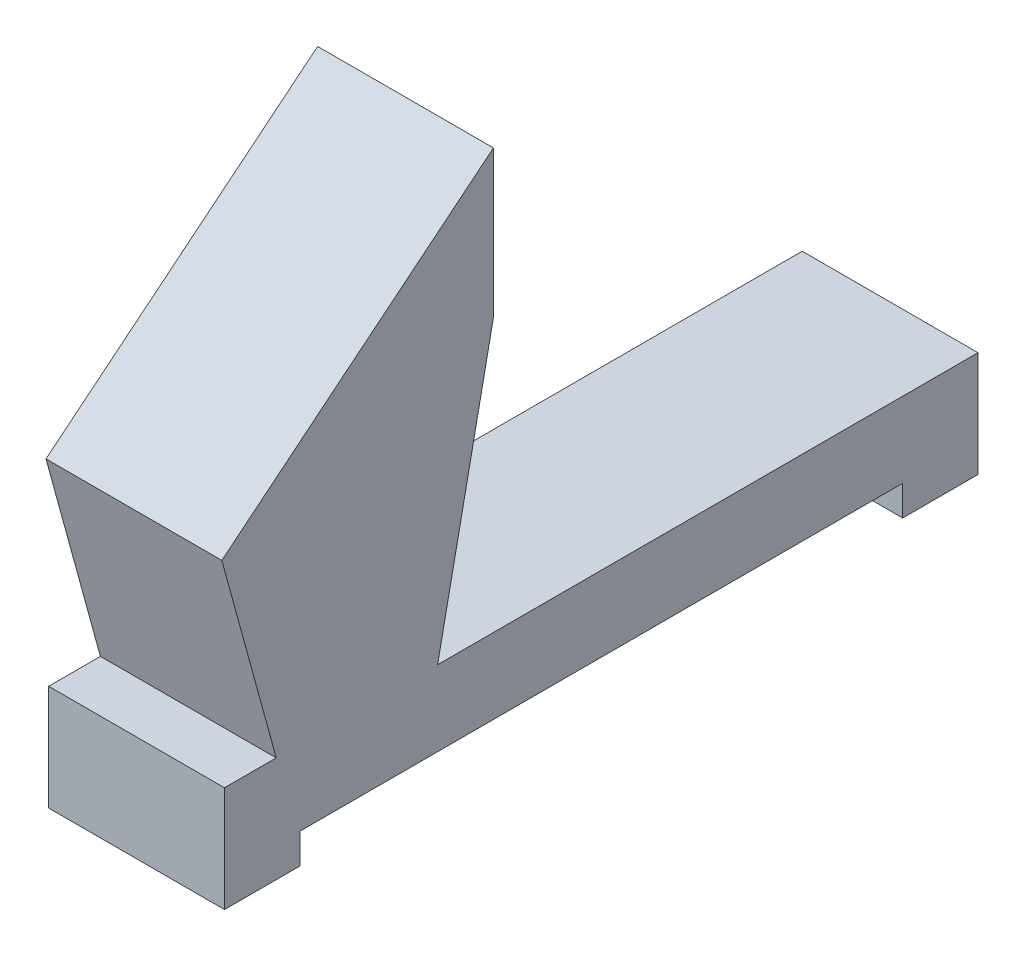
ISO-10303-21;
HEADER;
FILE_DESCRIPTION(('STEP AP214'),'2;1');
FILE_NAME('part.step','',(''),(''),'','','');
FILE_SCHEMA(('AUTOMOTIVE_DESIGN { 1 0 10303 214 1 1 1 1 }'));
ENDSEC;
DATA;
#1=APPLICATION_CONTEXT('core data for automotive mechanical design processes');
#2=APPLICATION_PROTOCOL_DEFINITION('international standard','automotive_design',2000,#1);
#3=PRODUCT_CONTEXT('',#1,'mechanical');
#4=PRODUCT('Part','Part','',(#3));
#5=PRODUCT_RELATED_PRODUCT_CATEGORY('part','',(#4));
#6=PRODUCT_DEFINITION_FORMATION('','',#4);
#7=PRODUCT_DEFINITION_CONTEXT('part definition',#1,'design');
#8=PRODUCT_DEFINITION('design','',#6,#7);
#9=PRODUCT_DEFINITION_SHAPE('','',#8);
#10=(LENGTH_UNIT() NAMED_UNIT(*) SI_UNIT(.MILLI.,.METRE.));
#11=(NAMED_UNIT(*) PLANE_ANGLE_UNIT() SI_UNIT($,.RADIAN.));
#12=(NAMED_UNIT(*) SI_UNIT($,.STERADIAN.) SOLID_ANGLE_UNIT());
#13=UNCERTAINTY_MEASURE_WITH_UNIT(LENGTH_MEASURE(1.E-05),#10,'distance_accuracy_value','');
#14=(GEOMETRIC_REPRESENTATION_CONTEXT(3) GLOBAL_UNCERTAINTY_ASSIGNED_CONTEXT((#13)) GLOBAL_UNIT_ASSIGNED_CONTEXT((#10,
#11,#12)) REPRESENTATION_CONTEXT('',''));
#15=CARTESIAN_POINT('',(0.,0.,0.));
#16=DIRECTION('',(0.,0.,1.));
#17=DIRECTION('',(1.,0.,0.));
#18=AXIS2_PLACEMENT_3D('',#15,#16,#17);
#19=CARTESIAN_POINT('',(-123.551519536903,-126.155426917511,7.50000000000059));
#20=DIRECTION('',(0.,1.,0.));
#21=DIRECTION('',(0.,0.,1.));
#22=AXIS2_PLACEMENT_3D('',#19,#20,#21);
#23=PLANE('',#22);
#24=DIRECTION('',(1.,0.,0.));
#25=VECTOR('',#24,1.);
#26=CARTESIAN_POINT('',(-123.551519536903,-126.155426917511,6.00000000000059));
#27=LINE('',#26,#25);
#28=CARTESIAN_POINT('',(-127.051519536903,-126.155426917511,6.00000000000059));
#29=VERTEX_POINT('',#28);
#30=CARTESIAN_POINT('',(-123.551519536903,-126.155426917511,6.00000000000059));
#31=VERTEX_POINT('',#30);
#32=EDGE_CURVE('E162',#29,#31,#27,.T.);
#33=ORIENTED_EDGE('',*,*,#32,.T.);
#34=DIRECTION('',(0.,0.,1.));
#35=VECTOR('',#34,1.);
#36=CARTESIAN_POINT('',(-123.551519536903,-126.155426917511,17.0639403381122));
#37=LINE('',#36,#35);
#38=CARTESIAN_POINT('',(-123.551519536903,-126.155426917511,7.50000000000059));
#39=VERTEX_POINT('',#38);
#40=EDGE_CURVE('E127',#31,#39,#37,.T.);
#41=ORIENTED_EDGE('',*,*,#40,.T.);
#42=DIRECTION('',(-1.,0.,0.));
#43=VECTOR('',#42,1.);
#44=CARTESIAN_POINT('',(-123.551519536903,-126.155426917511,7.50000000000059));
#45=LINE('',#44,#43);
#46=CARTESIAN_POINT('',(-127.051519536903,-126.155426917511,7.50000000000059));
#47=VERTEX_POINT('',#46);
#48=EDGE_CURVE('E125',#39,#47,#45,.T.);
#49=ORIENTED_EDGE('',*,*,#48,.T.);
#50=DIRECTION('',(0.,0.,1.));
#51=VECTOR('',#50,1.);
#52=CARTESIAN_POINT('',(-127.051519536903,-126.155426917511,7.50000000000059));
#53=LINE('',#52,#51);
#54=EDGE_CURVE('E20',#29,#47,#53,.T.);
#55=ORIENTED_EDGE('',*,*,#54,.F.);
#56=EDGE_LOOP('',(#33,#41,#49,#55));
#57=FACE_BOUND('',#56,.T.);
#58=ADVANCED_FACE('F17',(#57),#23,.F.);
#59=CARTESIAN_POINT('',(-123.551519536903,-125.555426917511,19.5000000000006));
#60=DIRECTION('',(0.,0.,1.));
#61=DIRECTION('',(0.,-1.,0.));
#62=AXIS2_PLACEMENT_3D('',#59,#60,#61);
#63=PLANE('',#62);
#64=DIRECTION('',(1.,0.,0.));
#65=VECTOR('',#64,1.);
#66=CARTESIAN_POINT('',(-123.551519536903,-125.555426917511,19.5000000000006));
#67=LINE('',#66,#65);
#68=CARTESIAN_POINT('',(-127.051519536903,-125.555426917511,19.5000000000006));
#69=VERTEX_POINT('',#68);
#70=CARTESIAN_POINT('',(-123.551519536903,-125.555426917511,19.5000000000006));
#71=VERTEX_POINT('',#70);
#72=EDGE_CURVE('E168',#69,#71,#67,.T.);
#73=ORIENTED_EDGE('',*,*,#72,.T.);
#74=DIRECTION('',(0.,-1.,0.));
#75=VECTOR('',#74,1.);
#76=CARTESIAN_POINT('',(-123.551519536903,-125.555426917511,19.5000000000006));
#77=LINE('',#76,#75);
#78=CARTESIAN_POINT('',(-123.551519536903,-126.155426917511,19.5000000000006));
#79=VERTEX_POINT('',#78);
#80=EDGE_CURVE('E146',#71,#79,#77,.T.);
#81=ORIENTED_EDGE('',*,*,#80,.T.);
#82=DIRECTION('',(1.,0.,0.));
#83=VECTOR('',#82,1.);
#84=CARTESIAN_POINT('',(-123.551519536903,-126.155426917511,19.5000000000006));
#85=LINE('',#84,#83);
#86=CARTESIAN_POINT('',(-127.051519536903,-126.155426917511,19.5000000000006));
#87=VERTEX_POINT('',#86);
#88=EDGE_CURVE('E135',#79,#87,#85,.F.);
#89=ORIENTED_EDGE('',*,*,#88,.T.);
#90=DIRECTION('',(0.,-1.,0.));
#91=VECTOR('',#90,1.);
#92=CARTESIAN_POINT('',(-127.051519536903,-125.555426917511,19.5000000000006));
#93=LINE('',#92,#91);
#94=EDGE_CURVE('E109',#69,#87,#93,.T.);
#95=ORIENTED_EDGE('',*,*,#94,.F.);
#96=EDGE_LOOP('',(#73,#81,#89,#95));
#97=FACE_BOUND('',#96,.T.);
#98=ADVANCED_FACE('F245',(#97),#63,.F.);
#99=CARTESIAN_POINT('',(-123.551519536903,-126.155426917511,7.50000000000059));
#100=DIRECTION('',(0.,0.,-1.));
#101=DIRECTION('',(-1.,0.,0.));
#102=AXIS2_PLACEMENT_3D('',#99,#100,#101);
#103=PLANE('',#102);
#104=ORIENTED_EDGE('',*,*,#48,.F.);
#105=DIRECTION('',(0.,-1.,0.));
#106=VECTOR('',#105,1.);
#107=CARTESIAN_POINT('',(-123.551519536903,-125.555426917511,7.50000000000059));
#108=LINE('',#107,#106);
#109=CARTESIAN_POINT('',(-123.551519536903,-125.555426917511,7.50000000000059));
#110=VERTEX_POINT('',#109);
#111=EDGE_CURVE('E144',#39,#110,#108,.F.);
#112=ORIENTED_EDGE('',*,*,#111,.T.);
#113=DIRECTION('',(1.,0.,0.));
#114=VECTOR('',#113,1.);
#115=CARTESIAN_POINT('',(-123.551519536903,-125.555426917511,7.50000000000059));
#116=LINE('',#115,#114);
#117=CARTESIAN_POINT('',(-127.051519536903,-125.555426917511,7.50000000000059));
#118=VERTEX_POINT('',#117);
#119=EDGE_CURVE('E133',#110,#118,#116,.F.);
#120=ORIENTED_EDGE('',*,*,#119,.T.);
#121=DIRECTION('',(0.,1.,0.));
#122=VECTOR('',#121,1.);
#123=CARTESIAN_POINT('',(-127.051519536903,-126.155426917511,7.50000000000059));
#124=LINE('',#123,#122);
#125=EDGE_CURVE('E117',#47,#118,#124,.T.);
#126=ORIENTED_EDGE('',*,*,#125,.F.);
#127=EDGE_LOOP('',(#104,#112,#120,#126));
#128=FACE_BOUND('',#127,.T.);
#129=ADVANCED_FACE('F131',(#128),#103,.F.);
#130=CARTESIAN_POINT('',(-123.551519536903,-126.155426917511,19.5000000000006));
#131=DIRECTION('',(0.,1.,0.));
#132=DIRECTION('',(0.,0.,1.));
#133=AXIS2_PLACEMENT_3D('',#130,#131,#132);
#134=PLANE('',#133);
#135=ORIENTED_EDGE('',*,*,#88,.F.);
#136=DIRECTION('',(0.,0.,1.));
#137=VECTOR('',#136,1.);
#138=CARTESIAN_POINT('',(-123.551519536903,-126.155426917511,17.0639403381122));
#139=LINE('',#138,#137);
#140=CARTESIAN_POINT('',(-123.551519536903,-126.155426917511,21.0000000000006));
#141=VERTEX_POINT('',#140);
#142=EDGE_CURVE('E148',#79,#141,#139,.T.);
#143=ORIENTED_EDGE('',*,*,#142,.T.);
#144=DIRECTION('',(-1.,0.,0.));
#145=VECTOR('',#144,1.);
#146=CARTESIAN_POINT('',(-123.551519536903,-126.155426917511,21.0000000000006));
#147=LINE('',#146,#145);
#148=CARTESIAN_POINT('',(-127.051519536903,-126.155426917511,21.0000000000006));
#149=VERTEX_POINT('',#148);
#150=EDGE_CURVE('E179',#141,#149,#147,.T.);
#151=ORIENTED_EDGE('',*,*,#150,.T.);
#152=DIRECTION('',(0.,0.,1.));
#153=VECTOR('',#152,1.);
#154=CARTESIAN_POINT('',(-127.051519536903,-126.155426917511,19.5000000000006));
#155=LINE('',#154,#153);
#156=EDGE_CURVE('E137',#87,#149,#155,.T.);
#157=ORIENTED_EDGE('',*,*,#156,.F.);
#158=EDGE_LOOP('',(#135,#143,#151,#157));
#159=FACE_BOUND('',#158,.T.);
#160=ADVANCED_FACE('F249',(#159),#134,.F.);
#161=CARTESIAN_POINT('',(-123.551519536903,-124.055426917511,19.9700041097668));
#162=DIRECTION('',(0.,-1.,0.));
#163=DIRECTION('',(1.,0.,0.));
#164=AXIS2_PLACEMENT_3D('',#161,#162,#163);
#165=PLANE('',#164);
#166=DIRECTION('',(-1.,0.,0.));
#167=VECTOR('',#166,1.);
#168=CARTESIAN_POINT('',(-123.551519536903,-124.055426917511,21.0000000000006));
#169=LINE('',#168,#167);
#170=CARTESIAN_POINT('',(-127.051519536903,-124.055426917511,21.0000000000006));
#171=VERTEX_POINT('',#170);
#172=CARTESIAN_POINT('',(-123.551519536903,-124.055426917511,21.0000000000006));
#173=VERTEX_POINT('',#172);
#174=EDGE_CURVE('E174',#171,#173,#169,.F.);
#175=ORIENTED_EDGE('',*,*,#174,.T.);
#176=DIRECTION('',(0.,0.,1.));
#177=VECTOR('',#176,1.);
#178=CARTESIAN_POINT('',(-123.551519536903,-124.055426917511,17.0639403381122));
#179=LINE('',#178,#177);
#180=CARTESIAN_POINT('',(-123.551519536903,-124.055426917511,19.9700041097668));
#181=VERTEX_POINT('',#180);
#182=EDGE_CURVE('E150',#173,#181,#179,.F.);
#183=ORIENTED_EDGE('',*,*,#182,.T.);
#184=DIRECTION('',(1.,0.,0.));
#185=VECTOR('',#184,1.);
#186=CARTESIAN_POINT('',(-123.551519536903,-124.055426917511,19.9700041097666));
#187=LINE('',#186,#185);
#188=CARTESIAN_POINT('',(-127.051519536903,-124.055426917511,19.9700041097668));
#189=VERTEX_POINT('',#188);
#190=EDGE_CURVE('E185',#181,#189,#187,.F.);
#191=ORIENTED_EDGE('',*,*,#190,.T.);
#192=DIRECTION('',(0.,0.,1.));
#193=VECTOR('',#192,1.);
#194=CARTESIAN_POINT('',(-127.051519536903,-124.055426917511,19.9700041097668));
#195=LINE('',#194,#193);
#196=EDGE_CURVE('E141',#171,#189,#195,.F.);
#197=ORIENTED_EDGE('',*,*,#196,.F.);
#198=EDGE_LOOP('',(#175,#183,#191,#197));
#199=FACE_BOUND('',#198,.T.);
#200=ADVANCED_FACE('F211',(#199),#165,.F.);
#201=CARTESIAN_POINT('',(-123.551519536903,-125.555426917511,17.0639403381122));
#202=DIRECTION('',(-1.,0.,0.));
#203=DIRECTION('',(0.,-1.,0.));
#204=AXIS2_PLACEMENT_3D('',#201,#202,#203);
#205=PLANE('',#204);
#206=DIRECTION('',(0.,-1.,0.));
#207=VECTOR('',#206,1.);
#208=CARTESIAN_POINT('',(-123.551519536903,-118.624720028178,15.6459770039855));
#209=LINE('',#208,#207);
#210=CARTESIAN_POINT('',(-123.551519536903,-118.624720028178,15.6459770039855));
#211=VERTEX_POINT('',#210);
#212=CARTESIAN_POINT('',(-123.551519536903,-115.701944266897,15.6459770039855));
#213=VERTEX_POINT('',#212);
#214=EDGE_CURVE('E152',#211,#213,#209,.F.);
#215=ORIENTED_EDGE('',*,*,#214,.T.);
#216=DIRECTION('',(0.,0.631747448880966,-0.775174277715915));
#217=VECTOR('',#216,1.);
#218=CARTESIAN_POINT('',(-123.551519536903,-115.701944266897,15.6459770039855));
#219=LINE('',#218,#217);
#220=CARTESIAN_POINT('',(-123.551519536903,-120.10865222546,21.0531482793661));
#221=VERTEX_POINT('',#220);
#222=EDGE_CURVE('E191',#213,#221,#219,.F.);
#223=ORIENTED_EDGE('',*,*,#222,.T.);
#224=DIRECTION('',(0.,0.964343870689292,0.264652411785711));
#225=VECTOR('',#224,1.);
#226=CARTESIAN_POINT('',(-123.551519536903,-120.10865222546,21.0531482793661));
#227=LINE('',#226,#225);
#228=EDGE_CURVE('E182',#221,#181,#227,.F.);
#229=ORIENTED_EDGE('',*,*,#228,.T.);
#230=ORIENTED_EDGE('',*,*,#182,.F.);
#231=DIRECTION('',(0.,1.,0.));
#232=VECTOR('',#231,1.);
#233=CARTESIAN_POINT('',(-123.551519536903,-124.055426917511,21.0000000000006));
#234=LINE('',#233,#232);
#235=EDGE_CURVE('E176',#173,#141,#234,.F.);
#236=ORIENTED_EDGE('',*,*,#235,.T.);
#237=ORIENTED_EDGE('',*,*,#142,.F.);
#238=ORIENTED_EDGE('',*,*,#80,.F.);
#239=DIRECTION('',(0.,0.,1.));
#240=VECTOR('',#239,1.);
#241=CARTESIAN_POINT('',(-123.551519536903,-125.555426917511,7.50000000000059));
#242=LINE('',#241,#240);
#243=EDGE_CURVE('E170',#71,#110,#242,.F.);
#244=ORIENTED_EDGE('',*,*,#243,.T.);
#245=ORIENTED_EDGE('',*,*,#111,.F.);
#246=ORIENTED_EDGE('',*,*,#40,.F.);
#247=DIRECTION('',(0.,-1.,0.));
#248=VECTOR('',#247,1.);
#249=CARTESIAN_POINT('',(-123.551519536903,-126.155426917511,6.00000000000059));
#250=LINE('',#249,#248);
#251=CARTESIAN_POINT('',(-123.551519536903,-124.055426917511,6.00000000000059));
#252=VERTEX_POINT('',#251);
#253=EDGE_CURVE('E164',#31,#252,#250,.F.);
#254=ORIENTED_EDGE('',*,*,#253,.T.);
#255=DIRECTION('',(0.,0.,1.));
#256=VECTOR('',#255,1.);
#257=CARTESIAN_POINT('',(-123.551519536903,-124.055426917511,6.00000000000059));
#258=LINE('',#257,#256);
#259=CARTESIAN_POINT('',(-123.551519536903,-124.055426917511,16.757053171312));
#260=VERTEX_POINT('',#259);
#261=EDGE_CURVE('E158',#252,#260,#258,.T.);
#262=ORIENTED_EDGE('',*,*,#261,.T.);
#263=DIRECTION('',(0.,-0.979706085298412,0.200439483209422));
#264=VECTOR('',#263,1.);
#265=CARTESIAN_POINT('',(-123.551519536903,-124.055426917511,16.757053171312));
#266=LINE('',#265,#264);
#267=EDGE_CURVE('E154',#260,#211,#266,.F.);
#268=ORIENTED_EDGE('',*,*,#267,.T.);
#269=EDGE_LOOP('',(#215,#223,#229,#230,#236,#237,#238,#244,#245,#246,#254,#262,#268));
#270=FACE_BOUND('',#269,.T.);
#271=ADVANCED_FACE('F216',(#270),#205,.F.);
#272=CARTESIAN_POINT('',(-123.551519536903,-118.624720028178,15.6459770039855));
#273=DIRECTION('',(0.,0.,1.));
#274=DIRECTION('',(0.,-1.,0.));
#275=AXIS2_PLACEMENT_3D('',#272,#273,#274);
#276=PLANE('',#275);
#277=DIRECTION('',(1.,0.,0.));
#278=VECTOR('',#277,1.);
#279=CARTESIAN_POINT('',(-123.551519536903,-115.701944266897,15.6459770039855));
#280=LINE('',#279,#278);
#281=CARTESIAN_POINT('',(-127.051519536903,-115.701944266897,15.6459770039855));
#282=VERTEX_POINT('',#281);
#283=EDGE_CURVE('E188',#282,#213,#280,.T.);
#284=ORIENTED_EDGE('',*,*,#283,.T.);
#285=ORIENTED_EDGE('',*,*,#214,.F.);
#286=DIRECTION('',(1.,0.,0.));
#287=VECTOR('',#286,1.);
#288=CARTESIAN_POINT('',(-123.551519536903,-118.624720028178,15.6459770039856));
#289=LINE('',#288,#287);
#290=CARTESIAN_POINT('',(-127.051519536903,-118.624720028178,15.6459770039855));
#291=VERTEX_POINT('',#290);
#292=EDGE_CURVE('E156',#211,#291,#289,.F.);
#293=ORIENTED_EDGE('',*,*,#292,.T.);
#294=DIRECTION('',(0.,-1.,0.));
#295=VECTOR('',#294,1.);
#296=CARTESIAN_POINT('',(-127.051519536903,-125.555426917511,15.6459770039855));
#297=LINE('',#296,#295);
#298=EDGE_CURVE('E194',#282,#291,#297,.T.);
#299=ORIENTED_EDGE('',*,*,#298,.F.);
#300=EDGE_LOOP('',(#284,#285,#293,#299));
#301=FACE_BOUND('',#300,.T.);
#302=ADVANCED_FACE('F223',(#301),#276,.F.);
#303=CARTESIAN_POINT('',(-123.551519536903,-124.055426917511,16.757053171312));
#304=DIRECTION('',(0.,0.200439483209422,0.979706085298412));
#305=DIRECTION('',(0.,-0.979706085298412,0.200439483209422));
#306=AXIS2_PLACEMENT_3D('',#303,#304,#305);
#307=PLANE('',#306);
#308=ORIENTED_EDGE('',*,*,#292,.F.);
#309=ORIENTED_EDGE('',*,*,#267,.F.);
#310=DIRECTION('',(1.,0.,0.));
#311=VECTOR('',#310,1.);
#312=CARTESIAN_POINT('',(-123.551519536903,-124.055426917511,16.757053171312));
#313=LINE('',#312,#311);
#314=CARTESIAN_POINT('',(-127.051519536903,-124.055426917511,16.757053171312));
#315=VERTEX_POINT('',#314);
#316=EDGE_CURVE('E160',#260,#315,#313,.F.);
#317=ORIENTED_EDGE('',*,*,#316,.T.);
#318=DIRECTION('',(0.,-0.97970608529841,0.200439483209431));
#319=VECTOR('',#318,1.);
#320=CARTESIAN_POINT('',(-127.051519536903,-118.624720028178,15.6459770039855));
#321=LINE('',#320,#319);
#322=EDGE_CURVE('E197',#291,#315,#321,.T.);
#323=ORIENTED_EDGE('',*,*,#322,.F.);
#324=EDGE_LOOP('',(#308,#309,#317,#323));
#325=FACE_BOUND('',#324,.T.);
#326=ADVANCED_FACE('F228',(#325),#307,.F.);
#327=CARTESIAN_POINT('',(-123.551519536903,-124.055426917511,6.00000000000059));
#328=DIRECTION('',(0.,-1.,0.));
#329=DIRECTION('',(1.,0.,0.));
#330=AXIS2_PLACEMENT_3D('',#327,#328,#329);
#331=PLANE('',#330);
#332=ORIENTED_EDGE('',*,*,#316,.F.);
#333=ORIENTED_EDGE('',*,*,#261,.F.);
#334=DIRECTION('',(1.,0.,0.));
#335=VECTOR('',#334,1.);
#336=CARTESIAN_POINT('',(-123.551519536903,-124.055426917511,6.00000000000059));
#337=LINE('',#336,#335);
#338=CARTESIAN_POINT('',(-127.051519536903,-124.055426917511,6.00000000000059));
#339=VERTEX_POINT('',#338);
#340=EDGE_CURVE('E166',#252,#339,#337,.F.);
#341=ORIENTED_EDGE('',*,*,#340,.T.);
#342=DIRECTION('',(0.,0.,1.));
#343=VECTOR('',#342,1.);
#344=CARTESIAN_POINT('',(-127.051519536903,-124.055426917511,17.0639403381122));
#345=LINE('',#344,#343);
#346=EDGE_CURVE('E200',#315,#339,#345,.F.);
#347=ORIENTED_EDGE('',*,*,#346,.F.);
#348=EDGE_LOOP('',(#332,#333,#341,#347));
#349=FACE_BOUND('',#348,.T.);
#350=ADVANCED_FACE('F233',(#349),#331,.F.);
#351=CARTESIAN_POINT('',(-123.551519536903,-126.155426917511,6.00000000000059));
#352=DIRECTION('',(0.,0.,1.));
#353=DIRECTION('',(0.,-1.,0.));
#354=AXIS2_PLACEMENT_3D('',#351,#352,#353);
#355=PLANE('',#354);
#356=ORIENTED_EDGE('',*,*,#340,.F.);
#357=ORIENTED_EDGE('',*,*,#253,.F.);
#358=ORIENTED_EDGE('',*,*,#32,.F.);
#359=DIRECTION('',(0.,-1.,0.));
#360=VECTOR('',#359,1.);
#361=CARTESIAN_POINT('',(-127.051519536903,-125.555426917511,6.00000000000059));
#362=LINE('',#361,#360);
#363=EDGE_CURVE('E121',#339,#29,#362,.T.);
#364=ORIENTED_EDGE('',*,*,#363,.F.);
#365=EDGE_LOOP('',(#356,#357,#358,#364));
#366=FACE_BOUND('',#365,.T.);
#367=ADVANCED_FACE('F237',(#366),#355,.F.);
#368=CARTESIAN_POINT('',(-123.551519536903,-125.555426917511,7.50000000000059));
#369=DIRECTION('',(0.,1.,0.));
#370=DIRECTION('',(0.,0.,1.));
#371=AXIS2_PLACEMENT_3D('',#368,#369,#370);
#372=PLANE('',#371);
#373=ORIENTED_EDGE('',*,*,#119,.F.);
#374=ORIENTED_EDGE('',*,*,#243,.F.);
#375=ORIENTED_EDGE('',*,*,#72,.F.);
#376=DIRECTION('',(0.,0.,1.));
#377=VECTOR('',#376,1.);
#378=CARTESIAN_POINT('',(-127.051519536903,-125.555426917511,17.0639403381122));
#379=LINE('',#378,#377);
#380=EDGE_CURVE('E203',#118,#69,#379,.T.);
#381=ORIENTED_EDGE('',*,*,#380,.F.);
#382=EDGE_LOOP('',(#373,#374,#375,#381));
#383=FACE_BOUND('',#382,.T.);
#384=ADVANCED_FACE('F243',(#383),#372,.F.);
#385=CARTESIAN_POINT('',(-123.551519536903,-124.055426917511,21.0000000000006));
#386=DIRECTION('',(0.,0.,-1.));
#387=DIRECTION('',(-1.,0.,0.));
#388=AXIS2_PLACEMENT_3D('',#385,#386,#387);
#389=PLANE('',#388);
#390=ORIENTED_EDGE('',*,*,#150,.F.);
#391=ORIENTED_EDGE('',*,*,#235,.F.);
#392=ORIENTED_EDGE('',*,*,#174,.F.);
#393=DIRECTION('',(0.,-1.,0.));
#394=VECTOR('',#393,1.);
#395=CARTESIAN_POINT('',(-127.051519536903,-125.555426917511,21.0000000000006));
#396=LINE('',#395,#394);
#397=EDGE_CURVE('E205',#149,#171,#396,.F.);
#398=ORIENTED_EDGE('',*,*,#397,.F.);
#399=EDGE_LOOP('',(#390,#391,#392,#398));
#400=FACE_BOUND('',#399,.T.);
#401=ADVANCED_FACE('F253',(#400),#389,.F.);
#402=CARTESIAN_POINT('',(-123.551519536903,-120.10865222546,21.0531482793661));
#403=DIRECTION('',(0.,0.264652411785711,-0.964343870689292));
#404=DIRECTION('',(0.,0.964343870689292,0.264652411785711));
#405=AXIS2_PLACEMENT_3D('',#402,#403,#404);
#406=PLANE('',#405);
#407=ORIENTED_EDGE('',*,*,#190,.F.);
#408=ORIENTED_EDGE('',*,*,#228,.F.);
#409=DIRECTION('',(1.,0.,0.));
#410=VECTOR('',#409,1.);
#411=CARTESIAN_POINT('',(-123.551519536903,-120.10865222546,21.0531482793661));
#412=LINE('',#411,#410);
#413=CARTESIAN_POINT('',(-127.051519536903,-120.10865222546,21.0531482793661));
#414=VERTEX_POINT('',#413);
#415=EDGE_CURVE('E35',#221,#414,#412,.F.);
#416=ORIENTED_EDGE('',*,*,#415,.T.);
#417=DIRECTION('',(0.,0.964343870689304,0.264652411785669));
#418=VECTOR('',#417,1.);
#419=CARTESIAN_POINT('',(-127.051519536903,-124.055426917511,19.9700041097668));
#420=LINE('',#419,#418);
#421=EDGE_CURVE('E26',#189,#414,#420,.T.);
#422=ORIENTED_EDGE('',*,*,#421,.F.);
#423=EDGE_LOOP('',(#407,#408,#416,#422));
#424=FACE_BOUND('',#423,.T.);
#425=ADVANCED_FACE('F209',(#424),#406,.F.);
#426=CARTESIAN_POINT('',(-123.551519536903,-115.701944266897,15.6459770039855));
#427=DIRECTION('',(0.,-0.775174277715915,-0.631747448880966));
#428=DIRECTION('',(0.,0.631747448880966,-0.775174277715915));
#429=AXIS2_PLACEMENT_3D('',#426,#427,#428);
#430=PLANE('',#429);
#431=ORIENTED_EDGE('',*,*,#415,.F.);
#432=ORIENTED_EDGE('',*,*,#222,.F.);
#433=ORIENTED_EDGE('',*,*,#283,.F.);
#434=DIRECTION('',(0.,0.631747448880957,-0.775174277715923));
#435=VECTOR('',#434,1.);
#436=CARTESIAN_POINT('',(-127.051519536903,-120.10865222546,21.0531482793661));
#437=LINE('',#436,#435);
#438=EDGE_CURVE('E11',#414,#282,#437,.T.);
#439=ORIENTED_EDGE('',*,*,#438,.F.);
#440=EDGE_LOOP('',(#431,#432,#433,#439));
#441=FACE_BOUND('',#440,.T.);
#442=ADVANCED_FACE('F221',(#441),#430,.F.);
#443=CARTESIAN_POINT('',(-127.051519536903,-125.555426917511,17.0639403381122));
#444=DIRECTION('',(-1.,0.,0.));
#445=DIRECTION('',(0.,-1.,0.));
#446=AXIS2_PLACEMENT_3D('',#443,#444,#445);
#447=PLANE('',#446);
#448=ORIENTED_EDGE('',*,*,#421,.T.);
#449=ORIENTED_EDGE('',*,*,#438,.T.);
#450=ORIENTED_EDGE('',*,*,#298,.T.);
#451=ORIENTED_EDGE('',*,*,#322,.T.);
#452=ORIENTED_EDGE('',*,*,#346,.T.);
#453=ORIENTED_EDGE('',*,*,#363,.T.);
#454=ORIENTED_EDGE('',*,*,#54,.T.);
#455=ORIENTED_EDGE('',*,*,#125,.T.);
#456=ORIENTED_EDGE('',*,*,#380,.T.);
#457=ORIENTED_EDGE('',*,*,#94,.T.);
#458=ORIENTED_EDGE('',*,*,#156,.T.);
#459=ORIENTED_EDGE('',*,*,#397,.T.);
#460=ORIENTED_EDGE('',*,*,#196,.T.);
#461=EDGE_LOOP('',(#448,#449,#450,#451,#452,#453,#454,#455,#456,#457,#458,#459,#460));
#462=FACE_BOUND('',#461,.T.);
#463=ADVANCED_FACE('F115',(#462),#447,.T.);
#464=CLOSED_SHELL('',(#58,#98,#129,#160,#200,#271,#302,#326,#350,#367,#384,#401,#425,#442,#463));
#465=MANIFOLD_SOLID_BREP('B1',#464);
#466=ADVANCED_BREP_SHAPE_REPRESENTATION('',(#18,#465),#14);
#467=SHAPE_DEFINITION_REPRESENTATION(#9,#466);
ENDSEC;
END-ISO-10303-21;
